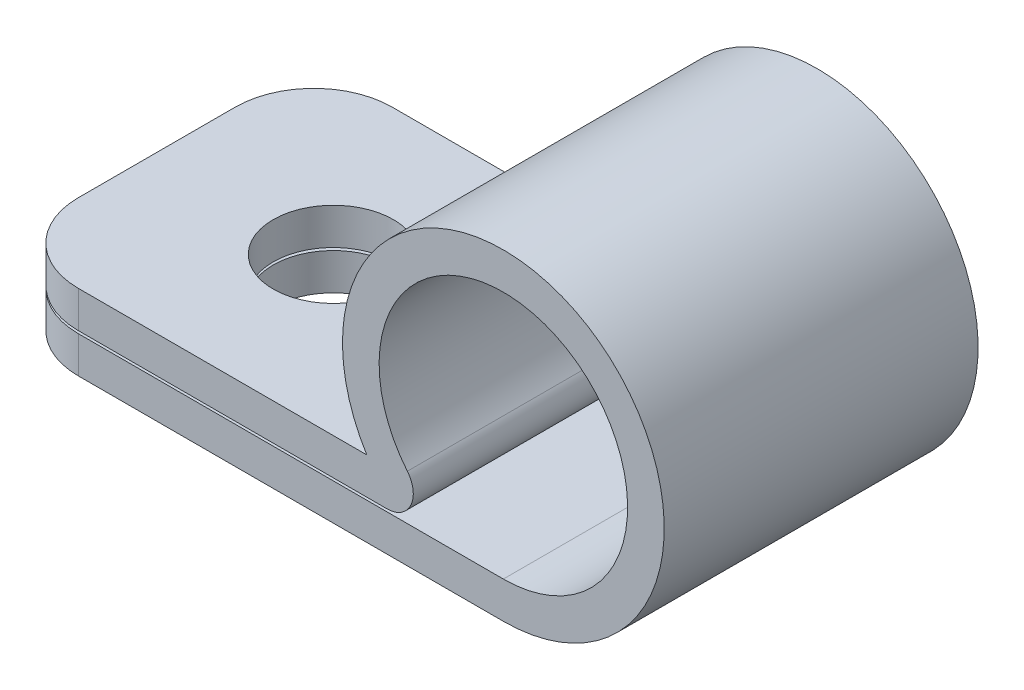
ISO-10303-21;
HEADER;
FILE_DESCRIPTION(('STEP AP214'),'2;1');
FILE_NAME('part.step','',(''),(''),'','','');
FILE_SCHEMA(('AUTOMOTIVE_DESIGN { 1 0 10303 214 1 1 1 1 }'));
ENDSEC;
DATA;
#1=APPLICATION_CONTEXT('core data for automotive mechanical design processes');
#2=APPLICATION_PROTOCOL_DEFINITION('international standard','automotive_design',2000,#1);
#3=PRODUCT_CONTEXT('',#1,'mechanical');
#4=PRODUCT('Part','Part','',(#3));
#5=PRODUCT_RELATED_PRODUCT_CATEGORY('part','',(#4));
#6=PRODUCT_DEFINITION_FORMATION('','',#4);
#7=PRODUCT_DEFINITION_CONTEXT('part definition',#1,'design');
#8=PRODUCT_DEFINITION('design','',#6,#7);
#9=PRODUCT_DEFINITION_SHAPE('','',#8);
#10=(LENGTH_UNIT() NAMED_UNIT(*) SI_UNIT(.MILLI.,.METRE.));
#11=(NAMED_UNIT(*) PLANE_ANGLE_UNIT() SI_UNIT($,.RADIAN.));
#12=(NAMED_UNIT(*) SI_UNIT($,.STERADIAN.) SOLID_ANGLE_UNIT());
#13=UNCERTAINTY_MEASURE_WITH_UNIT(LENGTH_MEASURE(1.E-05),#10,'distance_accuracy_value','');
#14=(GEOMETRIC_REPRESENTATION_CONTEXT(3) GLOBAL_UNCERTAINTY_ASSIGNED_CONTEXT((#13)) GLOBAL_UNIT_ASSIGNED_CONTEXT((#10,
#11,#12)) REPRESENTATION_CONTEXT('',''));
#15=CARTESIAN_POINT('',(0.,0.,0.));
#16=DIRECTION('',(0.,0.,1.));
#17=DIRECTION('',(1.,0.,0.));
#18=AXIS2_PLACEMENT_3D('',#15,#16,#17);
#19=CARTESIAN_POINT('',(-4.44297197830461,-3.25,12.));
#20=DIRECTION('',(0.,-1.,0.));
#21=DIRECTION('',(1.,0.,0.));
#22=AXIS2_PLACEMENT_3D('',#19,#20,#21);
#23=PLANE('',#22);
#24=CARTESIAN_POINT('',(-12.5,-3.25,6.));
#25=DIRECTION('',(0.,1.,0.));
#26=DIRECTION('',(-1.,0.,0.));
#27=AXIS2_PLACEMENT_3D('',#24,#25,#26);
#28=CIRCLE('',#27,2.3);
#29=CARTESIAN_POINT('',(-14.8,-3.25,6.));
#30=VERTEX_POINT('',#29);
#31=EDGE_CURVE('E294',#30,#30,#28,.T.);
#32=ORIENTED_EDGE('',*,*,#31,.F.);
#33=EDGE_LOOP('',(#32));
#34=FACE_BOUND('',#33,.T.);
#35=DIRECTION('',(0.,0.,-1.));
#36=VECTOR('',#35,1.);
#37=CARTESIAN_POINT('',(-19.25,-3.25,12.));
#38=LINE('',#37,#36);
#39=CARTESIAN_POINT('',(-19.25,-3.25,9.));
#40=VERTEX_POINT('',#39);
#41=CARTESIAN_POINT('',(-19.25,-3.25,3.));
#42=VERTEX_POINT('',#41);
#43=EDGE_CURVE('E183',#40,#42,#38,.T.);
#44=ORIENTED_EDGE('',*,*,#43,.F.);
#45=CARTESIAN_POINT('',(-16.25,-3.25,9.));
#46=DIRECTION('',(0.,-1.,0.));
#47=DIRECTION('',(1.,0.,0.));
#48=AXIS2_PLACEMENT_3D('',#45,#46,#47);
#49=CIRCLE('',#48,3.);
#50=CARTESIAN_POINT('',(-16.25,-3.25,12.));
#51=VERTEX_POINT('',#50);
#52=EDGE_CURVE('E208',#40,#51,#49,.F.);
#53=ORIENTED_EDGE('',*,*,#52,.T.);
#54=DIRECTION('',(-1.,0.,0.));
#55=VECTOR('',#54,1.);
#56=CARTESIAN_POINT('',(-4.44297197830461,-3.25,12.));
#57=LINE('',#56,#55);
#58=CARTESIAN_POINT('',(-5.22111099288265,-3.25,12.));
#59=VERTEX_POINT('',#58);
#60=EDGE_CURVE('E136',#59,#51,#57,.T.);
#61=ORIENTED_EDGE('',*,*,#60,.F.);
#62=DIRECTION('',(0.,0.,-1.));
#63=VECTOR('',#62,1.);
#64=CARTESIAN_POINT('',(-5.22111099288265,-3.25,12.));
#65=LINE('',#64,#63);
#66=CARTESIAN_POINT('',(-5.22111099288265,-3.25,0.));
#67=VERTEX_POINT('',#66);
#68=EDGE_CURVE('E147',#59,#67,#65,.T.);
#69=ORIENTED_EDGE('',*,*,#68,.T.);
#70=DIRECTION('',(-1.,0.,0.));
#71=VECTOR('',#70,1.);
#72=CARTESIAN_POINT('',(-4.44297197830461,-3.25,0.));
#73=LINE('',#72,#71);
#74=CARTESIAN_POINT('',(-16.25,-3.25,0.));
#75=VERTEX_POINT('',#74);
#76=EDGE_CURVE('E151',#67,#75,#73,.T.);
#77=ORIENTED_EDGE('',*,*,#76,.T.);
#78=CARTESIAN_POINT('',(-16.25,-3.25,3.));
#79=DIRECTION('',(0.,-1.,0.));
#80=DIRECTION('',(1.,0.,0.));
#81=AXIS2_PLACEMENT_3D('',#78,#79,#80);
#82=CIRCLE('',#81,3.);
#83=EDGE_CURVE('E37',#75,#42,#82,.F.);
#84=ORIENTED_EDGE('',*,*,#83,.T.);
#85=EDGE_LOOP('',(#44,#53,#61,#69,#77,#84));
#86=FACE_BOUND('',#85,.T.);
#87=ADVANCED_FACE('F17',(#34,#86),#23,.F.);
#88=CARTESIAN_POINT('',(-19.25,-4.65,12.));
#89=DIRECTION('',(-1.,0.,0.));
#90=DIRECTION('',(0.,0.,1.));
#91=AXIS2_PLACEMENT_3D('',#88,#89,#90);
#92=PLANE('',#91);
#93=DIRECTION('',(0.,0.,-1.));
#94=VECTOR('',#93,1.);
#95=CARTESIAN_POINT('',(-19.25,-4.65,12.));
#96=LINE('',#95,#94);
#97=CARTESIAN_POINT('',(-19.25,-4.65,9.));
#98=VERTEX_POINT('',#97);
#99=CARTESIAN_POINT('',(-19.25,-4.65,3.));
#100=VERTEX_POINT('',#99);
#101=EDGE_CURVE('E124',#98,#100,#96,.T.);
#102=ORIENTED_EDGE('',*,*,#101,.F.);
#103=DIRECTION('',(0.,1.,0.));
#104=VECTOR('',#103,1.);
#105=CARTESIAN_POINT('',(-19.25,-3.25,9.));
#106=LINE('',#105,#104);
#107=EDGE_CURVE('E204',#98,#40,#106,.T.);
#108=ORIENTED_EDGE('',*,*,#107,.T.);
#109=ORIENTED_EDGE('',*,*,#43,.T.);
#110=DIRECTION('',(0.,1.,0.));
#111=VECTOR('',#110,1.);
#112=CARTESIAN_POINT('',(-19.25,-4.65,3.));
#113=LINE('',#112,#111);
#114=EDGE_CURVE('E205',#42,#100,#113,.F.);
#115=ORIENTED_EDGE('',*,*,#114,.T.);
#116=EDGE_LOOP('',(#102,#108,#109,#115));
#117=FACE_BOUND('',#116,.T.);
#118=ADVANCED_FACE('F257',(#117),#92,.T.);
#119=CARTESIAN_POINT('',(-4.44297197830461,-4.65,12.));
#120=DIRECTION('',(0.,-1.,0.));
#121=DIRECTION('',(1.,0.,0.));
#122=AXIS2_PLACEMENT_3D('',#119,#120,#121);
#123=PLANE('',#122);
#124=CARTESIAN_POINT('',(-12.5,-4.65,6.));
#125=DIRECTION('',(0.,-1.,0.));
#126=DIRECTION('',(1.,0.,0.));
#127=AXIS2_PLACEMENT_3D('',#124,#125,#126);
#128=CIRCLE('',#127,2.3);
#129=CARTESIAN_POINT('',(-10.2,-4.65,6.));
#130=VERTEX_POINT('',#129);
#131=EDGE_CURVE('E152',#130,#130,#128,.T.);
#132=ORIENTED_EDGE('',*,*,#131,.F.);
#133=EDGE_LOOP('',(#132));
#134=FACE_BOUND('',#133,.T.);
#135=DIRECTION('',(-1.,0.,0.));
#136=VECTOR('',#135,1.);
#137=CARTESIAN_POINT('',(-4.44297197830461,-4.65,12.));
#138=LINE('',#137,#136);
#139=CARTESIAN_POINT('',(-4.44297197830461,-4.65,12.));
#140=VERTEX_POINT('',#139);
#141=CARTESIAN_POINT('',(-16.25,-4.65,12.));
#142=VERTEX_POINT('',#141);
#143=EDGE_CURVE('E116',#140,#142,#138,.T.);
#144=ORIENTED_EDGE('',*,*,#143,.T.);
#145=CARTESIAN_POINT('',(-16.25,-4.65,9.));
#146=DIRECTION('',(0.,-1.,0.));
#147=DIRECTION('',(1.,0.,0.));
#148=AXIS2_PLACEMENT_3D('',#145,#146,#147);
#149=CIRCLE('',#148,3.);
#150=EDGE_CURVE('E211',#142,#98,#149,.T.);
#151=ORIENTED_EDGE('',*,*,#150,.T.);
#152=ORIENTED_EDGE('',*,*,#101,.T.);
#153=CARTESIAN_POINT('',(-16.25,-4.65,3.));
#154=DIRECTION('',(0.,-1.,0.));
#155=DIRECTION('',(1.,0.,0.));
#156=AXIS2_PLACEMENT_3D('',#153,#154,#155);
#157=CIRCLE('',#156,3.);
#158=CARTESIAN_POINT('',(-16.25,-4.65,0.));
#159=VERTEX_POINT('',#158);
#160=EDGE_CURVE('E32',#100,#159,#157,.T.);
#161=ORIENTED_EDGE('',*,*,#160,.T.);
#162=DIRECTION('',(-1.,0.,0.));
#163=VECTOR('',#162,1.);
#164=CARTESIAN_POINT('',(-4.44297197830461,-4.65,0.));
#165=LINE('',#164,#163);
#166=CARTESIAN_POINT('',(-4.44297197830461,-4.65,0.));
#167=VERTEX_POINT('',#166);
#168=EDGE_CURVE('E119',#167,#159,#165,.T.);
#169=ORIENTED_EDGE('',*,*,#168,.F.);
#170=DIRECTION('',(0.,0.,-1.));
#171=VECTOR('',#170,1.);
#172=CARTESIAN_POINT('',(-4.44297197830461,-4.65,12.));
#173=LINE('',#172,#171);
#174=EDGE_CURVE('E114',#140,#167,#173,.T.);
#175=ORIENTED_EDGE('',*,*,#174,.F.);
#176=EDGE_LOOP('',(#144,#151,#152,#161,#169,#175));
#177=FACE_BOUND('',#176,.T.);
#178=ADVANCED_FACE('F113',(#134,#177),#123,.T.);
#179=CARTESIAN_POINT('',(-4.44297197830461,-3.65,12.));
#180=DIRECTION('',(0.,0.,-1.));
#181=DIRECTION('',(-1.,0.,0.));
#182=AXIS2_PLACEMENT_3D('',#179,#180,#181);
#183=CYLINDRICAL_SURFACE('',#182,1.);
#184=CARTESIAN_POINT('',(-4.44297197830461,-3.65,0.));
#185=DIRECTION('',(0.,0.,-1.));
#186=DIRECTION('',(1.,0.,0.));
#187=AXIS2_PLACEMENT_3D('',#184,#185,#186);
#188=CIRCLE('',#187,1.);
#189=CARTESIAN_POINT('',(-3.67028119946903,-3.01521739130435,0.));
#190=VERTEX_POINT('',#189);
#191=EDGE_CURVE('E156',#190,#167,#188,.T.);
#192=ORIENTED_EDGE('',*,*,#191,.F.);
#193=DIRECTION('',(0.,0.,-1.));
#194=VECTOR('',#193,1.);
#195=CARTESIAN_POINT('',(-3.67028119946903,-3.01521739130435,12.));
#196=LINE('',#195,#194);
#197=CARTESIAN_POINT('',(-3.67028119946903,-3.01521739130435,12.));
#198=VERTEX_POINT('',#197);
#199=EDGE_CURVE('E121',#198,#190,#196,.T.);
#200=ORIENTED_EDGE('',*,*,#199,.F.);
#201=CARTESIAN_POINT('',(-4.44297197830461,-3.65,12.));
#202=DIRECTION('',(0.,0.,-1.));
#203=DIRECTION('',(1.,0.,0.));
#204=AXIS2_PLACEMENT_3D('',#201,#202,#203);
#205=CIRCLE('',#204,1.);
#206=EDGE_CURVE('E131',#198,#140,#205,.T.);
#207=ORIENTED_EDGE('',*,*,#206,.T.);
#208=ORIENTED_EDGE('',*,*,#174,.T.);
#209=EDGE_LOOP('',(#192,#200,#207,#208));
#210=FACE_BOUND('',#209,.T.);
#211=ADVANCED_FACE('F138',(#210),#183,.T.);
#212=CARTESIAN_POINT('',(0.,0.,12.));
#213=DIRECTION('',(0.,0.,-1.));
#214=DIRECTION('',(-1.,0.,0.));
#215=AXIS2_PLACEMENT_3D('',#212,#213,#214);
#216=CYLINDRICAL_SURFACE('',#215,4.75);
#217=CARTESIAN_POINT('',(0.,0.,0.));
#218=DIRECTION('',(0.,0.,1.));
#219=DIRECTION('',(1.,0.,0.));
#220=AXIS2_PLACEMENT_3D('',#217,#218,#219);
#221=CIRCLE('',#220,4.75);
#222=CARTESIAN_POINT('',(0.,-4.75,0.));
#223=VERTEX_POINT('',#222);
#224=EDGE_CURVE('E158',#223,#190,#221,.T.);
#225=ORIENTED_EDGE('',*,*,#224,.F.);
#226=DIRECTION('',(0.,0.,-1.));
#227=VECTOR('',#226,1.);
#228=CARTESIAN_POINT('',(0.,-4.75,12.));
#229=LINE('',#228,#227);
#230=CARTESIAN_POINT('',(0.,-4.75,12.));
#231=VERTEX_POINT('',#230);
#232=EDGE_CURVE('E179',#231,#223,#229,.T.);
#233=ORIENTED_EDGE('',*,*,#232,.F.);
#234=CARTESIAN_POINT('',(0.,0.,12.));
#235=DIRECTION('',(0.,0.,1.));
#236=DIRECTION('',(1.,0.,0.));
#237=AXIS2_PLACEMENT_3D('',#234,#235,#236);
#238=CIRCLE('',#237,4.75);
#239=EDGE_CURVE('E137',#231,#198,#238,.T.);
#240=ORIENTED_EDGE('',*,*,#239,.T.);
#241=ORIENTED_EDGE('',*,*,#199,.T.);
#242=EDGE_LOOP('',(#225,#233,#240,#241));
#243=FACE_BOUND('',#242,.T.);
#244=ADVANCED_FACE('F250',(#243),#216,.F.);
#245=CARTESIAN_POINT('',(0.,-4.75,12.));
#246=DIRECTION('',(0.,1.,0.));
#247=DIRECTION('',(-1.,0.,0.));
#248=AXIS2_PLACEMENT_3D('',#245,#246,#247);
#249=PLANE('',#248);
#250=CARTESIAN_POINT('',(-12.5,-4.75,6.));
#251=DIRECTION('',(0.,1.,0.));
#252=DIRECTION('',(-1.,0.,0.));
#253=AXIS2_PLACEMENT_3D('',#250,#251,#252);
#254=CIRCLE('',#253,2.3);
#255=CARTESIAN_POINT('',(-14.8,-4.75,6.));
#256=VERTEX_POINT('',#255);
#257=EDGE_CURVE('E295',#256,#256,#254,.T.);
#258=ORIENTED_EDGE('',*,*,#257,.F.);
#259=EDGE_LOOP('',(#258));
#260=FACE_BOUND('',#259,.T.);
#261=DIRECTION('',(0.,0.,-1.));
#262=VECTOR('',#261,1.);
#263=CARTESIAN_POINT('',(-19.25,-4.75,12.));
#264=LINE('',#263,#262);
#265=CARTESIAN_POINT('',(-19.25,-4.75,9.));
#266=VERTEX_POINT('',#265);
#267=CARTESIAN_POINT('',(-19.25,-4.75,3.));
#268=VERTEX_POINT('',#267);
#269=EDGE_CURVE('E175',#266,#268,#264,.T.);
#270=ORIENTED_EDGE('',*,*,#269,.F.);
#271=CARTESIAN_POINT('',(-16.25,-4.75,9.));
#272=DIRECTION('',(0.,1.,0.));
#273=DIRECTION('',(-1.,0.,0.));
#274=AXIS2_PLACEMENT_3D('',#271,#272,#273);
#275=CIRCLE('',#274,3.);
#276=CARTESIAN_POINT('',(-16.25,-4.75,12.));
#277=VERTEX_POINT('',#276);
#278=EDGE_CURVE('E193',#266,#277,#275,.T.);
#279=ORIENTED_EDGE('',*,*,#278,.T.);
#280=DIRECTION('',(1.,0.,0.));
#281=VECTOR('',#280,1.);
#282=CARTESIAN_POINT('',(0.,-4.75,12.));
#283=LINE('',#282,#281);
#284=EDGE_CURVE('E143',#277,#231,#283,.T.);
#285=ORIENTED_EDGE('',*,*,#284,.T.);
#286=ORIENTED_EDGE('',*,*,#232,.T.);
#287=DIRECTION('',(1.,0.,0.));
#288=VECTOR('',#287,1.);
#289=CARTESIAN_POINT('',(0.,-4.75,0.));
#290=LINE('',#289,#288);
#291=CARTESIAN_POINT('',(-16.25,-4.75,0.));
#292=VERTEX_POINT('',#291);
#293=EDGE_CURVE('E161',#292,#223,#290,.T.);
#294=ORIENTED_EDGE('',*,*,#293,.F.);
#295=CARTESIAN_POINT('',(-16.25,-4.75,3.));
#296=DIRECTION('',(0.,1.,0.));
#297=DIRECTION('',(-1.,0.,0.));
#298=AXIS2_PLACEMENT_3D('',#295,#296,#297);
#299=CIRCLE('',#298,3.);
#300=EDGE_CURVE('E191',#292,#268,#299,.T.);
#301=ORIENTED_EDGE('',*,*,#300,.T.);
#302=EDGE_LOOP('',(#270,#279,#285,#286,#294,#301));
#303=FACE_BOUND('',#302,.T.);
#304=ADVANCED_FACE('F231',(#260,#303),#249,.T.);
#305=CARTESIAN_POINT('',(-19.25,-6.15,12.));
#306=DIRECTION('',(-1.,0.,0.));
#307=DIRECTION('',(0.,0.,1.));
#308=AXIS2_PLACEMENT_3D('',#305,#306,#307);
#309=PLANE('',#308);
#310=DIRECTION('',(0.,0.,-1.));
#311=VECTOR('',#310,1.);
#312=CARTESIAN_POINT('',(-19.25,-6.15,12.));
#313=LINE('',#312,#311);
#314=CARTESIAN_POINT('',(-19.25,-6.15,9.));
#315=VERTEX_POINT('',#314);
#316=CARTESIAN_POINT('',(-19.25,-6.15,3.));
#317=VERTEX_POINT('',#316);
#318=EDGE_CURVE('E172',#315,#317,#313,.T.);
#319=ORIENTED_EDGE('',*,*,#318,.F.);
#320=DIRECTION('',(0.,1.,0.));
#321=VECTOR('',#320,1.);
#322=CARTESIAN_POINT('',(-19.25,-4.75,9.));
#323=LINE('',#322,#321);
#324=EDGE_CURVE('E187',#315,#266,#323,.T.);
#325=ORIENTED_EDGE('',*,*,#324,.T.);
#326=ORIENTED_EDGE('',*,*,#269,.T.);
#327=DIRECTION('',(0.,1.,0.));
#328=VECTOR('',#327,1.);
#329=CARTESIAN_POINT('',(-19.25,-6.15,3.));
#330=LINE('',#329,#328);
#331=EDGE_CURVE('E186',#268,#317,#330,.F.);
#332=ORIENTED_EDGE('',*,*,#331,.T.);
#333=EDGE_LOOP('',(#319,#325,#326,#332));
#334=FACE_BOUND('',#333,.T.);
#335=ADVANCED_FACE('F236',(#334),#309,.T.);
#336=CARTESIAN_POINT('',(0.,-6.15,12.));
#337=DIRECTION('',(0.,1.,0.));
#338=DIRECTION('',(-1.,0.,0.));
#339=AXIS2_PLACEMENT_3D('',#336,#337,#338);
#340=PLANE('',#339);
#341=CARTESIAN_POINT('',(-12.5,-6.15,6.));
#342=DIRECTION('',(0.,1.,0.));
#343=DIRECTION('',(-1.,0.,0.));
#344=AXIS2_PLACEMENT_3D('',#341,#342,#343);
#345=CIRCLE('',#344,2.3);
#346=CARTESIAN_POINT('',(-14.8,-6.15,6.));
#347=VERTEX_POINT('',#346);
#348=EDGE_CURVE('E292',#347,#347,#345,.T.);
#349=ORIENTED_EDGE('',*,*,#348,.T.);
#350=EDGE_LOOP('',(#349));
#351=FACE_BOUND('',#350,.T.);
#352=DIRECTION('',(1.,0.,0.));
#353=VECTOR('',#352,1.);
#354=CARTESIAN_POINT('',(0.,-6.15,12.));
#355=LINE('',#354,#353);
#356=CARTESIAN_POINT('',(-16.25,-6.15,12.));
#357=VERTEX_POINT('',#356);
#358=CARTESIAN_POINT('',(0.,-6.15,12.));
#359=VERTEX_POINT('',#358);
#360=EDGE_CURVE('E148',#357,#359,#355,.T.);
#361=ORIENTED_EDGE('',*,*,#360,.F.);
#362=CARTESIAN_POINT('',(-16.25,-6.15,9.));
#363=DIRECTION('',(0.,1.,0.));
#364=DIRECTION('',(-1.,0.,0.));
#365=AXIS2_PLACEMENT_3D('',#362,#363,#364);
#366=CIRCLE('',#365,3.);
#367=EDGE_CURVE('E199',#357,#315,#366,.F.);
#368=ORIENTED_EDGE('',*,*,#367,.T.);
#369=ORIENTED_EDGE('',*,*,#318,.T.);
#370=CARTESIAN_POINT('',(-16.25,-6.15,3.));
#371=DIRECTION('',(0.,1.,0.));
#372=DIRECTION('',(-1.,0.,0.));
#373=AXIS2_PLACEMENT_3D('',#370,#371,#372);
#374=CIRCLE('',#373,3.);
#375=CARTESIAN_POINT('',(-16.25,-6.15,0.));
#376=VERTEX_POINT('',#375);
#377=EDGE_CURVE('E196',#317,#376,#374,.F.);
#378=ORIENTED_EDGE('',*,*,#377,.T.);
#379=DIRECTION('',(1.,0.,0.));
#380=VECTOR('',#379,1.);
#381=CARTESIAN_POINT('',(0.,-6.15,0.));
#382=LINE('',#381,#380);
#383=CARTESIAN_POINT('',(0.,-6.15,0.));
#384=VERTEX_POINT('',#383);
#385=EDGE_CURVE('E162',#376,#384,#382,.T.);
#386=ORIENTED_EDGE('',*,*,#385,.T.);
#387=DIRECTION('',(0.,0.,-1.));
#388=VECTOR('',#387,1.);
#389=CARTESIAN_POINT('',(0.,-6.15,12.));
#390=LINE('',#389,#388);
#391=EDGE_CURVE('E166',#359,#384,#390,.T.);
#392=ORIENTED_EDGE('',*,*,#391,.F.);
#393=EDGE_LOOP('',(#361,#368,#369,#378,#386,#392));
#394=FACE_BOUND('',#393,.T.);
#395=ADVANCED_FACE('F301',(#351,#394),#340,.F.);
#396=CARTESIAN_POINT('',(0.,0.,12.));
#397=DIRECTION('',(0.,0.,-1.));
#398=DIRECTION('',(-1.,0.,0.));
#399=AXIS2_PLACEMENT_3D('',#396,#397,#398);
#400=CYLINDRICAL_SURFACE('',#399,6.15);
#401=CARTESIAN_POINT('',(0.,0.,0.));
#402=DIRECTION('',(0.,0.,1.));
#403=DIRECTION('',(1.,0.,0.));
#404=AXIS2_PLACEMENT_3D('',#401,#402,#403);
#405=CIRCLE('',#404,6.15);
#406=EDGE_CURVE('E164',#384,#67,#405,.T.);
#407=ORIENTED_EDGE('',*,*,#406,.T.);
#408=ORIENTED_EDGE('',*,*,#68,.F.);
#409=CARTESIAN_POINT('',(0.,0.,12.));
#410=DIRECTION('',(0.,0.,1.));
#411=DIRECTION('',(1.,0.,0.));
#412=AXIS2_PLACEMENT_3D('',#409,#410,#411);
#413=CIRCLE('',#412,6.15);
#414=EDGE_CURVE('E146',#359,#59,#413,.T.);
#415=ORIENTED_EDGE('',*,*,#414,.F.);
#416=ORIENTED_EDGE('',*,*,#391,.T.);
#417=EDGE_LOOP('',(#407,#408,#415,#416));
#418=FACE_BOUND('',#417,.T.);
#419=ADVANCED_FACE('F224',(#418),#400,.T.);
#420=CARTESIAN_POINT('',(-4.44297197830461,-3.65,12.));
#421=DIRECTION('',(0.,0.,-1.));
#422=DIRECTION('',(-1.,0.,0.));
#423=AXIS2_PLACEMENT_3D('',#420,#421,#422);
#424=PLANE('',#423);
#425=ORIENTED_EDGE('',*,*,#284,.F.);
#426=DIRECTION('',(0.,1.,0.));
#427=VECTOR('',#426,1.);
#428=CARTESIAN_POINT('',(-16.25,-6.15,12.));
#429=LINE('',#428,#427);
#430=EDGE_CURVE('E198',#277,#357,#429,.F.);
#431=ORIENTED_EDGE('',*,*,#430,.T.);
#432=ORIENTED_EDGE('',*,*,#360,.T.);
#433=ORIENTED_EDGE('',*,*,#414,.T.);
#434=ORIENTED_EDGE('',*,*,#60,.T.);
#435=DIRECTION('',(0.,1.,0.));
#436=VECTOR('',#435,1.);
#437=CARTESIAN_POINT('',(-16.25,-4.65,12.));
#438=LINE('',#437,#436);
#439=EDGE_CURVE('E134',#51,#142,#438,.F.);
#440=ORIENTED_EDGE('',*,*,#439,.T.);
#441=ORIENTED_EDGE('',*,*,#143,.F.);
#442=ORIENTED_EDGE('',*,*,#206,.F.);
#443=ORIENTED_EDGE('',*,*,#239,.F.);
#444=EDGE_LOOP('',(#425,#431,#432,#433,#434,#440,#441,#442,#443));
#445=FACE_BOUND('',#444,.T.);
#446=ADVANCED_FACE('F127',(#445),#424,.F.);
#447=CARTESIAN_POINT('',(-4.44297197830461,-3.65,0.));
#448=DIRECTION('',(0.,0.,-1.));
#449=DIRECTION('',(-1.,0.,0.));
#450=AXIS2_PLACEMENT_3D('',#447,#448,#449);
#451=PLANE('',#450);
#452=ORIENTED_EDGE('',*,*,#385,.F.);
#453=DIRECTION('',(0.,1.,0.));
#454=VECTOR('',#453,1.);
#455=CARTESIAN_POINT('',(-16.25,-3.65,0.));
#456=LINE('',#455,#454);
#457=EDGE_CURVE('E11',#376,#292,#456,.T.);
#458=ORIENTED_EDGE('',*,*,#457,.T.);
#459=ORIENTED_EDGE('',*,*,#293,.T.);
#460=ORIENTED_EDGE('',*,*,#224,.T.);
#461=ORIENTED_EDGE('',*,*,#191,.T.);
#462=ORIENTED_EDGE('',*,*,#168,.T.);
#463=DIRECTION('',(0.,1.,0.));
#464=VECTOR('',#463,1.);
#465=CARTESIAN_POINT('',(-16.25,-3.65,0.));
#466=LINE('',#465,#464);
#467=EDGE_CURVE('E25',#159,#75,#466,.T.);
#468=ORIENTED_EDGE('',*,*,#467,.T.);
#469=ORIENTED_EDGE('',*,*,#76,.F.);
#470=ORIENTED_EDGE('',*,*,#406,.F.);
#471=EDGE_LOOP('',(#452,#458,#459,#460,#461,#462,#468,#469,#470));
#472=FACE_BOUND('',#471,.T.);
#473=ADVANCED_FACE('F214',(#472),#451,.T.);
#474=CARTESIAN_POINT('',(-12.5,-6.15,6.));
#475=DIRECTION('',(0.,1.,0.));
#476=DIRECTION('',(-1.,0.,0.));
#477=AXIS2_PLACEMENT_3D('',#474,#475,#476);
#478=CYLINDRICAL_SURFACE('',#477,2.3);
#479=ORIENTED_EDGE('',*,*,#257,.T.);
#480=EDGE_LOOP('',(#479));
#481=FACE_BOUND('',#480,.T.);
#482=ORIENTED_EDGE('',*,*,#348,.F.);
#483=EDGE_LOOP('',(#482));
#484=FACE_BOUND('',#483,.T.);
#485=ADVANCED_FACE('F303',(#481,#484),#478,.F.);
#486=ORIENTED_EDGE('',*,*,#131,.T.);
#487=EDGE_LOOP('',(#486));
#488=FACE_BOUND('',#487,.T.);
#489=ORIENTED_EDGE('',*,*,#31,.T.);
#490=EDGE_LOOP('',(#489));
#491=FACE_BOUND('',#490,.T.);
#492=ADVANCED_FACE('F274',(#488,#491),#478,.F.);
#493=CARTESIAN_POINT('',(-16.25,-6.15,9.));
#494=DIRECTION('',(0.,-1.,0.));
#495=DIRECTION('',(0.,0.,-1.));
#496=AXIS2_PLACEMENT_3D('',#493,#494,#495);
#497=CYLINDRICAL_SURFACE('',#496,3.);
#498=ORIENTED_EDGE('',*,*,#367,.F.);
#499=ORIENTED_EDGE('',*,*,#430,.F.);
#500=ORIENTED_EDGE('',*,*,#278,.F.);
#501=ORIENTED_EDGE('',*,*,#324,.F.);
#502=EDGE_LOOP('',(#498,#499,#500,#501));
#503=FACE_BOUND('',#502,.T.);
#504=ADVANCED_FACE('F241',(#503),#497,.T.);
#505=CARTESIAN_POINT('',(-16.25,-4.65,9.));
#506=DIRECTION('',(0.,-1.,0.));
#507=DIRECTION('',(0.,0.,-1.));
#508=AXIS2_PLACEMENT_3D('',#505,#506,#507);
#509=CYLINDRICAL_SURFACE('',#508,3.);
#510=ORIENTED_EDGE('',*,*,#150,.F.);
#511=ORIENTED_EDGE('',*,*,#439,.F.);
#512=ORIENTED_EDGE('',*,*,#52,.F.);
#513=ORIENTED_EDGE('',*,*,#107,.F.);
#514=EDGE_LOOP('',(#510,#511,#512,#513));
#515=FACE_BOUND('',#514,.T.);
#516=ADVANCED_FACE('F273',(#515),#509,.T.);
#517=CARTESIAN_POINT('',(-16.25,-3.65,3.));
#518=DIRECTION('',(0.,1.,0.));
#519=DIRECTION('',(0.,0.,1.));
#520=AXIS2_PLACEMENT_3D('',#517,#518,#519);
#521=CYLINDRICAL_SURFACE('',#520,3.);
#522=ORIENTED_EDGE('',*,*,#377,.F.);
#523=ORIENTED_EDGE('',*,*,#331,.F.);
#524=ORIENTED_EDGE('',*,*,#300,.F.);
#525=ORIENTED_EDGE('',*,*,#457,.F.);
#526=EDGE_LOOP('',(#522,#523,#524,#525));
#527=FACE_BOUND('',#526,.T.);
#528=ADVANCED_FACE('F230',(#527),#521,.T.);
#529=CARTESIAN_POINT('',(-16.25,-3.65,3.));
#530=DIRECTION('',(0.,1.,0.));
#531=DIRECTION('',(0.,0.,1.));
#532=AXIS2_PLACEMENT_3D('',#529,#530,#531);
#533=CYLINDRICAL_SURFACE('',#532,3.);
#534=ORIENTED_EDGE('',*,*,#160,.F.);
#535=ORIENTED_EDGE('',*,*,#114,.F.);
#536=ORIENTED_EDGE('',*,*,#83,.F.);
#537=ORIENTED_EDGE('',*,*,#467,.F.);
#538=EDGE_LOOP('',(#534,#535,#536,#537));
#539=FACE_BOUND('',#538,.T.);
#540=ADVANCED_FACE('F19',(#539),#533,.T.);
#541=CLOSED_SHELL('',(#87,#118,#178,#211,#244,#304,#335,#395,#419,#446,#473,#485,#492,#504,#516,
#528,#540));
#542=MANIFOLD_SOLID_BREP('B1',#541);
#543=ADVANCED_BREP_SHAPE_REPRESENTATION('',(#18,#542),#14);
#544=SHAPE_DEFINITION_REPRESENTATION(#9,#543);
ENDSEC;
END-ISO-10303-21;
